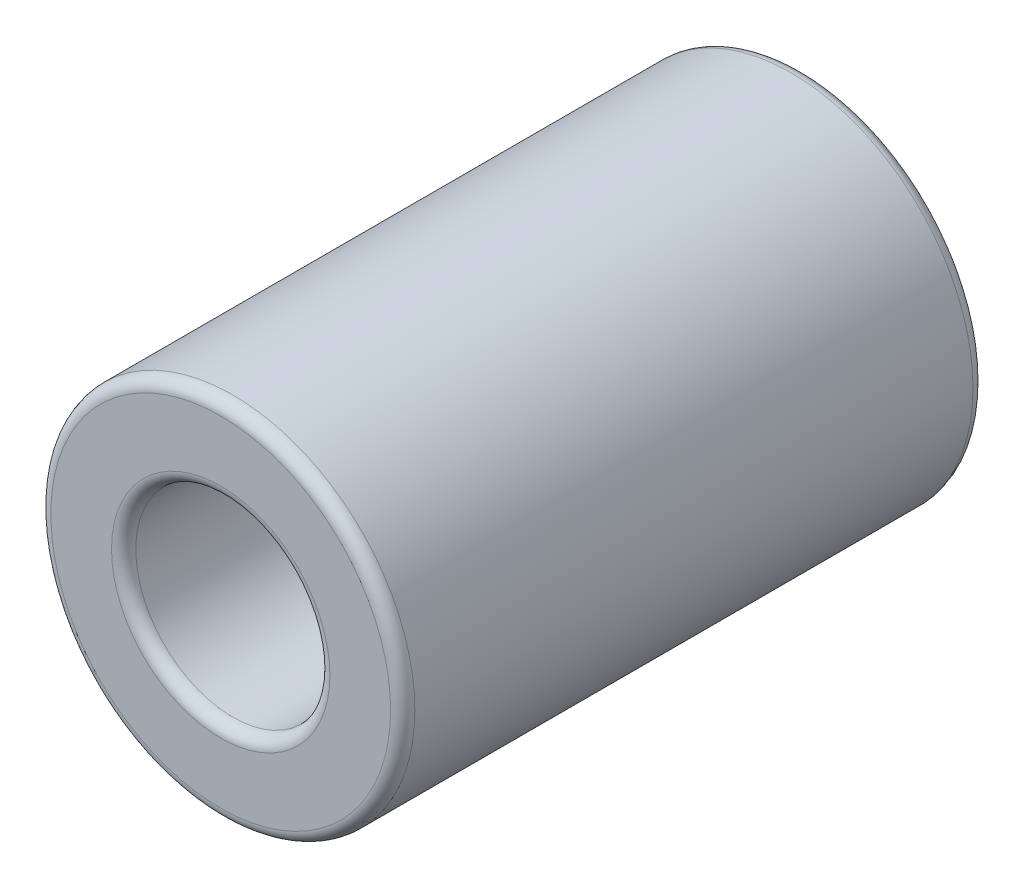
ISO-10303-21;
HEADER;
FILE_DESCRIPTION(('STEP AP214'),'2;1');
FILE_NAME('part.step','',(''),(''),'','','');
FILE_SCHEMA(('AUTOMOTIVE_DESIGN { 1 0 10303 214 1 1 1 1 }'));
ENDSEC;
DATA;
#1=APPLICATION_CONTEXT('core data for automotive mechanical design processes');
#2=APPLICATION_PROTOCOL_DEFINITION('international standard','automotive_design',2000,#1);
#3=PRODUCT_CONTEXT('',#1,'mechanical');
#4=PRODUCT('Part','Part','',(#3));
#5=PRODUCT_RELATED_PRODUCT_CATEGORY('part','',(#4));
#6=PRODUCT_DEFINITION_FORMATION('','',#4);
#7=PRODUCT_DEFINITION_CONTEXT('part definition',#1,'design');
#8=PRODUCT_DEFINITION('design','',#6,#7);
#9=PRODUCT_DEFINITION_SHAPE('','',#8);
#10=(LENGTH_UNIT() NAMED_UNIT(*) SI_UNIT(.MILLI.,.METRE.));
#11=(NAMED_UNIT(*) PLANE_ANGLE_UNIT() SI_UNIT($,.RADIAN.));
#12=(NAMED_UNIT(*) SI_UNIT($,.STERADIAN.) SOLID_ANGLE_UNIT());
#13=UNCERTAINTY_MEASURE_WITH_UNIT(LENGTH_MEASURE(1.E-05),#10,'distance_accuracy_value','');
#14=(GEOMETRIC_REPRESENTATION_CONTEXT(3) GLOBAL_UNCERTAINTY_ASSIGNED_CONTEXT((#13)) GLOBAL_UNIT_ASSIGNED_CONTEXT((#10,
#11,#12)) REPRESENTATION_CONTEXT('',''));
#15=CARTESIAN_POINT('',(0.,0.,0.));
#16=DIRECTION('',(0.,0.,1.));
#17=DIRECTION('',(1.,0.,0.));
#18=AXIS2_PLACEMENT_3D('',#15,#16,#17);
#19=CARTESIAN_POINT('',(0.,0.,24.));
#20=DIRECTION('',(0.,0.,1.));
#21=DIRECTION('',(1.,0.,0.));
#22=AXIS2_PLACEMENT_3D('',#19,#20,#21);
#23=PLANE('',#22);
#24=CARTESIAN_POINT('',(0.,0.,24.));
#25=DIRECTION('',(0.,0.,1.));
#26=DIRECTION('',(1.,0.,0.));
#27=AXIS2_PLACEMENT_3D('',#24,#25,#26);
#28=CIRCLE('',#27,4.5);
#29=CARTESIAN_POINT('',(4.5,0.,24.));
#30=VERTEX_POINT('',#29);
#31=EDGE_CURVE('E62',#30,#30,#28,.F.);
#32=ORIENTED_EDGE('',*,*,#31,.T.);
#33=EDGE_LOOP('',(#32));
#34=FACE_BOUND('',#33,.T.);
#35=CARTESIAN_POINT('',(0.,0.,24.));
#36=DIRECTION('',(0.,0.,1.));
#37=DIRECTION('',(1.,0.,0.));
#38=AXIS2_PLACEMENT_3D('',#35,#36,#37);
#39=CIRCLE('',#38,7.);
#40=CARTESIAN_POINT('',(7.,0.,24.));
#41=VERTEX_POINT('',#40);
#42=EDGE_CURVE('E67',#41,#41,#39,.T.);
#43=ORIENTED_EDGE('',*,*,#42,.T.);
#44=EDGE_LOOP('',(#43));
#45=FACE_BOUND('',#44,.T.);
#46=ADVANCED_FACE('F49',(#34,#45),#23,.T.);
#47=CARTESIAN_POINT('',(0.,0.,0.));
#48=DIRECTION('',(0.,0.,1.));
#49=DIRECTION('',(1.,0.,0.));
#50=AXIS2_PLACEMENT_3D('',#47,#48,#49);
#51=PLANE('',#50);
#52=CARTESIAN_POINT('',(0.,0.,0.));
#53=DIRECTION('',(0.,0.,1.));
#54=DIRECTION('',(1.,0.,0.));
#55=AXIS2_PLACEMENT_3D('',#52,#53,#54);
#56=CIRCLE('',#55,4.5);
#57=CARTESIAN_POINT('',(4.5,0.,0.));
#58=VERTEX_POINT('',#57);
#59=EDGE_CURVE('E81',#58,#58,#56,.T.);
#60=ORIENTED_EDGE('',*,*,#59,.T.);
#61=EDGE_LOOP('',(#60));
#62=FACE_BOUND('',#61,.T.);
#63=CARTESIAN_POINT('',(0.,0.,0.));
#64=DIRECTION('',(0.,0.,1.));
#65=DIRECTION('',(1.,0.,0.));
#66=AXIS2_PLACEMENT_3D('',#63,#64,#65);
#67=CIRCLE('',#66,7.);
#68=CARTESIAN_POINT('',(7.,0.,0.));
#69=VERTEX_POINT('',#68);
#70=EDGE_CURVE('E85',#69,#69,#67,.F.);
#71=ORIENTED_EDGE('',*,*,#70,.T.);
#72=EDGE_LOOP('',(#71));
#73=FACE_BOUND('',#72,.T.);
#74=ADVANCED_FACE('F90',(#62,#73),#51,.F.);
#75=CARTESIAN_POINT('',(0.,0.,24.));
#76=DIRECTION('',(0.,0.,-1.));
#77=DIRECTION('',(-1.,0.,0.));
#78=AXIS2_PLACEMENT_3D('',#75,#76,#77);
#79=CYLINDRICAL_SURFACE('',#78,7.5);
#80=CARTESIAN_POINT('',(0.,0.,23.5));
#81=DIRECTION('',(0.,0.,1.));
#82=DIRECTION('',(1.,0.,0.));
#83=AXIS2_PLACEMENT_3D('',#80,#81,#82);
#84=CIRCLE('',#83,7.5);
#85=CARTESIAN_POINT('',(7.5,0.,23.5));
#86=VERTEX_POINT('',#85);
#87=EDGE_CURVE('E10',#86,#86,#84,.F.);
#88=ORIENTED_EDGE('',*,*,#87,.T.);
#89=EDGE_LOOP('',(#88));
#90=FACE_BOUND('',#89,.T.);
#91=CARTESIAN_POINT('',(0.,0.,0.5));
#92=DIRECTION('',(0.,0.,1.));
#93=DIRECTION('',(1.,0.,0.));
#94=AXIS2_PLACEMENT_3D('',#91,#92,#93);
#95=CIRCLE('',#94,7.5);
#96=CARTESIAN_POINT('',(7.5,0.,0.5));
#97=VERTEX_POINT('',#96);
#98=EDGE_CURVE('E57',#97,#97,#95,.T.);
#99=ORIENTED_EDGE('',*,*,#98,.T.);
#100=EDGE_LOOP('',(#99));
#101=FACE_BOUND('',#100,.T.);
#102=ADVANCED_FACE('F106',(#90,#101),#79,.T.);
#103=CARTESIAN_POINT('',(0.,0.,24.));
#104=DIRECTION('',(0.,0.,-1.));
#105=DIRECTION('',(-1.,0.,0.));
#106=AXIS2_PLACEMENT_3D('',#103,#104,#105);
#107=CYLINDRICAL_SURFACE('',#106,4.);
#108=CARTESIAN_POINT('',(0.,0.,0.5));
#109=DIRECTION('',(0.,0.,1.));
#110=DIRECTION('',(1.,0.,0.));
#111=AXIS2_PLACEMENT_3D('',#108,#109,#110);
#112=CIRCLE('',#111,4.);
#113=CARTESIAN_POINT('',(4.,0.,0.5));
#114=VERTEX_POINT('',#113);
#115=EDGE_CURVE('E73',#114,#114,#112,.F.);
#116=ORIENTED_EDGE('',*,*,#115,.T.);
#117=EDGE_LOOP('',(#116));
#118=FACE_BOUND('',#117,.T.);
#119=CARTESIAN_POINT('',(0.,0.,23.5));
#120=DIRECTION('',(0.,0.,1.));
#121=DIRECTION('',(1.,0.,0.));
#122=AXIS2_PLACEMENT_3D('',#119,#120,#121);
#123=CIRCLE('',#122,4.);
#124=CARTESIAN_POINT('',(4.,0.,23.5));
#125=VERTEX_POINT('',#124);
#126=EDGE_CURVE('E77',#125,#125,#123,.T.);
#127=ORIENTED_EDGE('',*,*,#126,.T.);
#128=EDGE_LOOP('',(#127));
#129=FACE_BOUND('',#128,.T.);
#130=ADVANCED_FACE('F111',(#118,#129),#107,.F.);
#131=CARTESIAN_POINT('',(0.,0.,0.5));
#132=DIRECTION('',(0.,0.,1.));
#133=DIRECTION('',(1.,0.,0.));
#134=AXIS2_PLACEMENT_3D('',#131,#132,#133);
#135=TOROIDAL_SURFACE('',#134,4.5,0.5);
#136=ORIENTED_EDGE('',*,*,#115,.F.);
#137=EDGE_LOOP('',(#136));
#138=FACE_BOUND('',#137,.T.);
#139=ORIENTED_EDGE('',*,*,#59,.F.);
#140=EDGE_LOOP('',(#139));
#141=FACE_BOUND('',#140,.T.);
#142=ADVANCED_FACE('F115',(#138,#141),#135,.T.);
#143=CARTESIAN_POINT('',(0.,0.,23.5));
#144=DIRECTION('',(0.,0.,1.));
#145=DIRECTION('',(1.,0.,0.));
#146=AXIS2_PLACEMENT_3D('',#143,#144,#145);
#147=TOROIDAL_SURFACE('',#146,4.5,0.5);
#148=ORIENTED_EDGE('',*,*,#31,.F.);
#149=EDGE_LOOP('',(#148));
#150=FACE_BOUND('',#149,.T.);
#151=ORIENTED_EDGE('',*,*,#126,.F.);
#152=EDGE_LOOP('',(#151));
#153=FACE_BOUND('',#152,.T.);
#154=ADVANCED_FACE('F98',(#150,#153),#147,.T.);
#155=CARTESIAN_POINT('',(0.,0.,23.5));
#156=DIRECTION('',(0.,0.,1.));
#157=DIRECTION('',(1.,0.,0.));
#158=AXIS2_PLACEMENT_3D('',#155,#156,#157);
#159=TOROIDAL_SURFACE('',#158,7.,0.5);
#160=ORIENTED_EDGE('',*,*,#87,.F.);
#161=EDGE_LOOP('',(#160));
#162=FACE_BOUND('',#161,.T.);
#163=ORIENTED_EDGE('',*,*,#42,.F.);
#164=EDGE_LOOP('',(#163));
#165=FACE_BOUND('',#164,.T.);
#166=ADVANCED_FACE('F94',(#162,#165),#159,.T.);
#167=CARTESIAN_POINT('',(0.,0.,0.5));
#168=DIRECTION('',(0.,0.,1.));
#169=DIRECTION('',(1.,0.,0.));
#170=AXIS2_PLACEMENT_3D('',#167,#168,#169);
#171=TOROIDAL_SURFACE('',#170,7.,0.5);
#172=ORIENTED_EDGE('',*,*,#70,.F.);
#173=EDGE_LOOP('',(#172));
#174=FACE_BOUND('',#173,.T.);
#175=ORIENTED_EDGE('',*,*,#98,.F.);
#176=EDGE_LOOP('',(#175));
#177=FACE_BOUND('',#176,.T.);
#178=ADVANCED_FACE('F51',(#174,#177),#171,.T.);
#179=CLOSED_SHELL('',(#46,#74,#102,#130,#142,#154,#166,#178));
#180=MANIFOLD_SOLID_BREP('B2',#179);
#181=ADVANCED_BREP_SHAPE_REPRESENTATION('',(#18,#180),#14);
#182=SHAPE_DEFINITION_REPRESENTATION(#9,#181);
ENDSEC;
END-ISO-10303-21;
